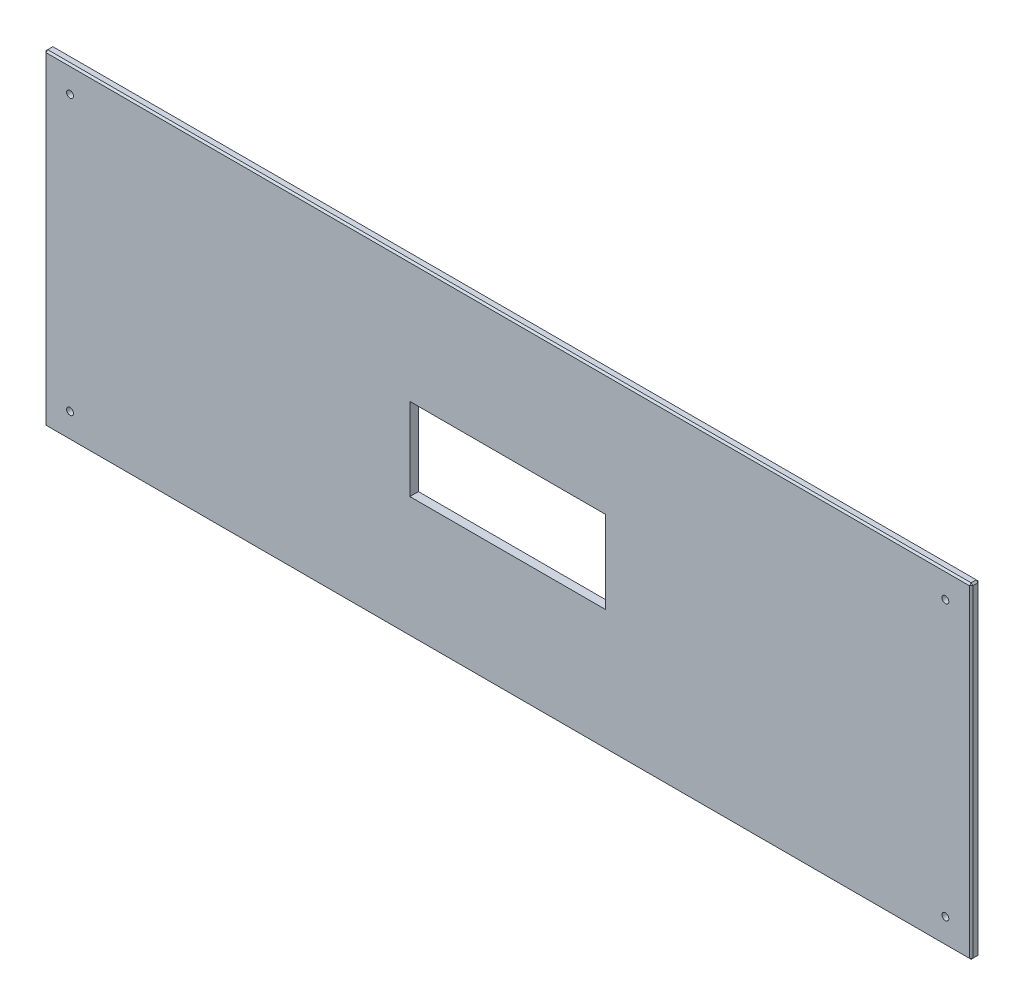
ISO-10303-21;
HEADER;
FILE_DESCRIPTION(('STEP AP214'),'2;1');
FILE_NAME('part.step','',(''),(''),'','','');
FILE_SCHEMA(('AUTOMOTIVE_DESIGN { 1 0 10303 214 1 1 1 1 }'));
ENDSEC;
DATA;
#1=APPLICATION_CONTEXT('core data for automotive mechanical design processes');
#2=APPLICATION_PROTOCOL_DEFINITION('international standard','automotive_design',2000,#1);
#3=PRODUCT_CONTEXT('',#1,'mechanical');
#4=PRODUCT('Part','Part','',(#3));
#5=PRODUCT_RELATED_PRODUCT_CATEGORY('part','',(#4));
#6=PRODUCT_DEFINITION_FORMATION('','',#4);
#7=PRODUCT_DEFINITION_CONTEXT('part definition',#1,'design');
#8=PRODUCT_DEFINITION('design','',#6,#7);
#9=PRODUCT_DEFINITION_SHAPE('','',#8);
#10=(LENGTH_UNIT() NAMED_UNIT(*) SI_UNIT(.MILLI.,.METRE.));
#11=(NAMED_UNIT(*) PLANE_ANGLE_UNIT() SI_UNIT($,.RADIAN.));
#12=(NAMED_UNIT(*) SI_UNIT($,.STERADIAN.) SOLID_ANGLE_UNIT());
#13=UNCERTAINTY_MEASURE_WITH_UNIT(LENGTH_MEASURE(1.E-05),#10,'distance_accuracy_value','');
#14=(GEOMETRIC_REPRESENTATION_CONTEXT(3) GLOBAL_UNCERTAINTY_ASSIGNED_CONTEXT((#13)) GLOBAL_UNIT_ASSIGNED_CONTEXT((#10,
#11,#12)) REPRESENTATION_CONTEXT('',''));
#15=CARTESIAN_POINT('',(0.,0.,0.));
#16=DIRECTION('',(0.,0.,1.));
#17=DIRECTION('',(1.,0.,0.));
#18=AXIS2_PLACEMENT_3D('',#15,#16,#17);
#19=CARTESIAN_POINT('',(0.,0.,5.));
#20=DIRECTION('',(1.,0.,0.));
#21=DIRECTION('',(0.,0.,-1.));
#22=AXIS2_PLACEMENT_3D('',#19,#20,#21);
#23=PLANE('',#22);
#24=DIRECTION('',(0.,0.,-1.));
#25=VECTOR('',#24,1.);
#26=CARTESIAN_POINT('',(0.,189.,5.));
#27=LINE('',#26,#25);
#28=CARTESIAN_POINT('',(0.,189.,4.00000000000011));
#29=VERTEX_POINT('',#28);
#30=CARTESIAN_POINT('',(0.,189.,0.99999999999989));
#31=VERTEX_POINT('',#30);
#32=EDGE_CURVE('E247',#29,#31,#27,.T.);
#33=ORIENTED_EDGE('',*,*,#32,.T.);
#34=DIRECTION('',(0.,-1.,0.));
#35=VECTOR('',#34,1.);
#36=CARTESIAN_POINT('',(0.,0.,0.99999999999989));
#37=LINE('',#36,#35);
#38=CARTESIAN_POINT('',(0.,0.99999999999989,0.99999999999989));
#39=VERTEX_POINT('',#38);
#40=EDGE_CURVE('E249',#31,#39,#37,.T.);
#41=ORIENTED_EDGE('',*,*,#40,.T.);
#42=DIRECTION('',(0.,0.,1.));
#43=VECTOR('',#42,1.);
#44=CARTESIAN_POINT('',(0.,0.99999999999989,5.));
#45=LINE('',#44,#43);
#46=CARTESIAN_POINT('',(0.,0.99999999999989,4.00000000000011));
#47=VERTEX_POINT('',#46);
#48=EDGE_CURVE('E243',#39,#47,#45,.T.);
#49=ORIENTED_EDGE('',*,*,#48,.T.);
#50=DIRECTION('',(0.,1.,0.));
#51=VECTOR('',#50,1.);
#52=CARTESIAN_POINT('',(0.,0.,4.00000000000011));
#53=LINE('',#52,#51);
#54=EDGE_CURVE('E245',#47,#29,#53,.T.);
#55=ORIENTED_EDGE('',*,*,#54,.T.);
#56=EDGE_LOOP('',(#33,#41,#49,#55));
#57=FACE_BOUND('',#56,.T.);
#58=ADVANCED_FACE('F40',(#57),#23,.F.);
#59=CARTESIAN_POINT('',(0.,0.,5.));
#60=DIRECTION('',(0.,1.,0.));
#61=DIRECTION('',(0.,0.,1.));
#62=AXIS2_PLACEMENT_3D('',#59,#60,#61);
#63=PLANE('',#62);
#64=DIRECTION('',(0.,0.,-1.));
#65=VECTOR('',#64,1.);
#66=CARTESIAN_POINT('',(0.99999999999989,0.,5.));
#67=LINE('',#66,#65);
#68=CARTESIAN_POINT('',(0.99999999999989,0.,4.00000000000011));
#69=VERTEX_POINT('',#68);
#70=CARTESIAN_POINT('',(0.99999999999989,0.,0.99999999999989));
#71=VERTEX_POINT('',#70);
#72=EDGE_CURVE('E211',#69,#71,#67,.T.);
#73=ORIENTED_EDGE('',*,*,#72,.T.);
#74=DIRECTION('',(1.,0.,0.));
#75=VECTOR('',#74,1.);
#76=CARTESIAN_POINT('',(540.,0.,0.99999999999989));
#77=LINE('',#76,#75);
#78=CARTESIAN_POINT('',(539.,0.,0.99999999999989));
#79=VERTEX_POINT('',#78);
#80=EDGE_CURVE('E213',#71,#79,#77,.T.);
#81=ORIENTED_EDGE('',*,*,#80,.T.);
#82=DIRECTION('',(0.,0.,1.));
#83=VECTOR('',#82,1.);
#84=CARTESIAN_POINT('',(539.,0.,5.));
#85=LINE('',#84,#83);
#86=CARTESIAN_POINT('',(539.,0.,4.00000000000011));
#87=VERTEX_POINT('',#86);
#88=EDGE_CURVE('E206',#79,#87,#85,.T.);
#89=ORIENTED_EDGE('',*,*,#88,.T.);
#90=DIRECTION('',(-1.,0.,0.));
#91=VECTOR('',#90,1.);
#92=CARTESIAN_POINT('',(0.,0.,4.00000000000011));
#93=LINE('',#92,#91);
#94=EDGE_CURVE('E208',#87,#69,#93,.T.);
#95=ORIENTED_EDGE('',*,*,#94,.T.);
#96=EDGE_LOOP('',(#73,#81,#89,#95));
#97=FACE_BOUND('',#96,.T.);
#98=ADVANCED_FACE('F351',(#97),#63,.F.);
#99=CARTESIAN_POINT('',(540.,0.,5.));
#100=DIRECTION('',(-1.,0.,0.));
#101=DIRECTION('',(0.,0.,1.));
#102=AXIS2_PLACEMENT_3D('',#99,#100,#101);
#103=PLANE('',#102);
#104=DIRECTION('',(0.,0.,-1.));
#105=VECTOR('',#104,1.);
#106=CARTESIAN_POINT('',(540.,0.99999999999989,5.));
#107=LINE('',#106,#105);
#108=CARTESIAN_POINT('',(540.,0.99999999999989,4.00000000000011));
#109=VERTEX_POINT('',#108);
#110=CARTESIAN_POINT('',(540.,0.99999999999989,0.99999999999989));
#111=VERTEX_POINT('',#110);
#112=EDGE_CURVE('E229',#109,#111,#107,.T.);
#113=ORIENTED_EDGE('',*,*,#112,.T.);
#114=DIRECTION('',(0.,1.,0.));
#115=VECTOR('',#114,1.);
#116=CARTESIAN_POINT('',(540.,190.,0.99999999999989));
#117=LINE('',#116,#115);
#118=CARTESIAN_POINT('',(540.,189.,0.99999999999989));
#119=VERTEX_POINT('',#118);
#120=EDGE_CURVE('E231',#111,#119,#117,.T.);
#121=ORIENTED_EDGE('',*,*,#120,.T.);
#122=DIRECTION('',(0.,0.,1.));
#123=VECTOR('',#122,1.);
#124=CARTESIAN_POINT('',(540.,189.,5.));
#125=LINE('',#124,#123);
#126=CARTESIAN_POINT('',(540.,189.,4.00000000000011));
#127=VERTEX_POINT('',#126);
#128=EDGE_CURVE('E225',#119,#127,#125,.T.);
#129=ORIENTED_EDGE('',*,*,#128,.T.);
#130=DIRECTION('',(0.,-1.,0.));
#131=VECTOR('',#130,1.);
#132=CARTESIAN_POINT('',(540.,0.,4.00000000000011));
#133=LINE('',#132,#131);
#134=EDGE_CURVE('E227',#127,#109,#133,.T.);
#135=ORIENTED_EDGE('',*,*,#134,.T.);
#136=EDGE_LOOP('',(#113,#121,#129,#135));
#137=FACE_BOUND('',#136,.T.);
#138=ADVANCED_FACE('F357',(#137),#103,.F.);
#139=CARTESIAN_POINT('',(0.,190.,5.));
#140=DIRECTION('',(0.,-1.,0.));
#141=DIRECTION('',(0.,0.,-1.));
#142=AXIS2_PLACEMENT_3D('',#139,#140,#141);
#143=PLANE('',#142);
#144=DIRECTION('',(-1.,0.,0.));
#145=VECTOR('',#144,1.);
#146=CARTESIAN_POINT('',(0.,190.,0.99999999999989));
#147=LINE('',#146,#145);
#148=CARTESIAN_POINT('',(539.,190.,0.99999999999989));
#149=VERTEX_POINT('',#148);
#150=CARTESIAN_POINT('',(0.99999999999989,190.,0.99999999999989));
#151=VERTEX_POINT('',#150);
#152=EDGE_CURVE('E238',#149,#151,#147,.T.);
#153=ORIENTED_EDGE('',*,*,#152,.T.);
#154=DIRECTION('',(0.,0.,1.));
#155=VECTOR('',#154,1.);
#156=CARTESIAN_POINT('',(0.99999999999989,190.,5.));
#157=LINE('',#156,#155);
#158=CARTESIAN_POINT('',(0.99999999999989,190.,4.00000000000011));
#159=VERTEX_POINT('',#158);
#160=EDGE_CURVE('E241',#151,#159,#157,.T.);
#161=ORIENTED_EDGE('',*,*,#160,.T.);
#162=DIRECTION('',(1.,0.,0.));
#163=VECTOR('',#162,1.);
#164=CARTESIAN_POINT('',(0.,190.,4.00000000000011));
#165=LINE('',#164,#163);
#166=CARTESIAN_POINT('',(539.,190.,4.00000000000011));
#167=VERTEX_POINT('',#166);
#168=EDGE_CURVE('E236',#159,#167,#165,.T.);
#169=ORIENTED_EDGE('',*,*,#168,.T.);
#170=DIRECTION('',(0.,0.,-1.));
#171=VECTOR('',#170,1.);
#172=CARTESIAN_POINT('',(539.,190.,5.));
#173=LINE('',#172,#171);
#174=EDGE_CURVE('E234',#167,#149,#173,.T.);
#175=ORIENTED_EDGE('',*,*,#174,.T.);
#176=EDGE_LOOP('',(#153,#161,#169,#175));
#177=FACE_BOUND('',#176,.T.);
#178=ADVANCED_FACE('F533',(#177),#143,.F.);
#179=CARTESIAN_POINT('',(0.,0.,5.));
#180=DIRECTION('',(0.,0.,-1.));
#181=DIRECTION('',(-1.,0.,0.));
#182=AXIS2_PLACEMENT_3D('',#179,#180,#181);
#183=PLANE('',#182);
#184=DIRECTION('',(1.,0.,0.));
#185=VECTOR('',#184,1.);
#186=CARTESIAN_POINT('',(213.,71.,5.));
#187=LINE('',#186,#185);
#188=CARTESIAN_POINT('',(213.,71.,5.));
#189=VERTEX_POINT('',#188);
#190=CARTESIAN_POINT('',(327.,71.,5.));
#191=VERTEX_POINT('',#190);
#192=EDGE_CURVE('E165',#189,#191,#187,.T.);
#193=ORIENTED_EDGE('',*,*,#192,.F.);
#194=DIRECTION('',(0.,-1.,0.));
#195=VECTOR('',#194,1.);
#196=CARTESIAN_POINT('',(213.,119.,5.));
#197=LINE('',#196,#195);
#198=CARTESIAN_POINT('',(213.,119.,5.));
#199=VERTEX_POINT('',#198);
#200=EDGE_CURVE('E56',#199,#189,#197,.T.);
#201=ORIENTED_EDGE('',*,*,#200,.F.);
#202=DIRECTION('',(-1.,0.,0.));
#203=VECTOR('',#202,1.);
#204=CARTESIAN_POINT('',(213.,119.,5.));
#205=LINE('',#204,#203);
#206=CARTESIAN_POINT('',(327.,119.,5.));
#207=VERTEX_POINT('',#206);
#208=EDGE_CURVE('E172',#207,#199,#205,.T.);
#209=ORIENTED_EDGE('',*,*,#208,.F.);
#210=DIRECTION('',(0.,1.,0.));
#211=VECTOR('',#210,1.);
#212=CARTESIAN_POINT('',(327.,119.,5.));
#213=LINE('',#212,#211);
#214=EDGE_CURVE('E156',#191,#207,#213,.T.);
#215=ORIENTED_EDGE('',*,*,#214,.F.);
#216=EDGE_LOOP('',(#193,#201,#209,#215));
#217=FACE_BOUND('',#216,.T.);
#218=CARTESIAN_POINT('',(525.,15.,5.));
#219=DIRECTION('',(0.,0.,1.));
#220=DIRECTION('',(1.,0.,0.));
#221=AXIS2_PLACEMENT_3D('',#218,#219,#220);
#222=CIRCLE('',#221,2.);
#223=CARTESIAN_POINT('',(527.,15.,5.));
#224=VERTEX_POINT('',#223);
#225=EDGE_CURVE('E192',#224,#224,#222,.T.);
#226=ORIENTED_EDGE('',*,*,#225,.F.);
#227=EDGE_LOOP('',(#226));
#228=FACE_BOUND('',#227,.T.);
#229=CARTESIAN_POINT('',(15.,175.,5.));
#230=DIRECTION('',(0.,0.,1.));
#231=DIRECTION('',(1.,0.,0.));
#232=AXIS2_PLACEMENT_3D('',#229,#230,#231);
#233=CIRCLE('',#232,2.);
#234=CARTESIAN_POINT('',(17.,175.,5.));
#235=VERTEX_POINT('',#234);
#236=EDGE_CURVE('E185',#235,#235,#233,.T.);
#237=ORIENTED_EDGE('',*,*,#236,.F.);
#238=EDGE_LOOP('',(#237));
#239=FACE_BOUND('',#238,.T.);
#240=CARTESIAN_POINT('',(15.,15.,5.));
#241=DIRECTION('',(0.,0.,1.));
#242=DIRECTION('',(1.,0.,0.));
#243=AXIS2_PLACEMENT_3D('',#240,#241,#242);
#244=CIRCLE('',#243,2.00000000000001);
#245=CARTESIAN_POINT('',(17.,15.,5.));
#246=VERTEX_POINT('',#245);
#247=EDGE_CURVE('E179',#246,#246,#244,.T.);
#248=ORIENTED_EDGE('',*,*,#247,.F.);
#249=EDGE_LOOP('',(#248));
#250=FACE_BOUND('',#249,.T.);
#251=CARTESIAN_POINT('',(525.,175.,5.));
#252=DIRECTION('',(0.,0.,1.));
#253=DIRECTION('',(1.,0.,0.));
#254=AXIS2_PLACEMENT_3D('',#251,#252,#253);
#255=CIRCLE('',#254,2.);
#256=CARTESIAN_POINT('',(527.,175.,5.));
#257=VERTEX_POINT('',#256);
#258=EDGE_CURVE('E191',#257,#257,#255,.T.);
#259=ORIENTED_EDGE('',*,*,#258,.F.);
#260=EDGE_LOOP('',(#259));
#261=FACE_BOUND('',#260,.T.);
#262=DIRECTION('',(0.,1.,0.));
#263=VECTOR('',#262,1.);
#264=CARTESIAN_POINT('',(539.,0.,5.));
#265=LINE('',#264,#263);
#266=CARTESIAN_POINT('',(539.,0.99999999999989,5.));
#267=VERTEX_POINT('',#266);
#268=CARTESIAN_POINT('',(539.,189.,5.));
#269=VERTEX_POINT('',#268);
#270=EDGE_CURVE('E252',#267,#269,#265,.T.);
#271=ORIENTED_EDGE('',*,*,#270,.T.);
#272=DIRECTION('',(-1.,0.,0.));
#273=VECTOR('',#272,1.);
#274=CARTESIAN_POINT('',(0.,189.,5.));
#275=LINE('',#274,#273);
#276=CARTESIAN_POINT('',(0.99999999999989,189.,5.));
#277=VERTEX_POINT('',#276);
#278=EDGE_CURVE('E258',#269,#277,#275,.T.);
#279=ORIENTED_EDGE('',*,*,#278,.T.);
#280=DIRECTION('',(0.,-1.,0.));
#281=VECTOR('',#280,1.);
#282=CARTESIAN_POINT('',(0.99999999999989,0.,5.));
#283=LINE('',#282,#281);
#284=CARTESIAN_POINT('',(0.99999999999989,0.99999999999989,5.));
#285=VERTEX_POINT('',#284);
#286=EDGE_CURVE('E256',#277,#285,#283,.T.);
#287=ORIENTED_EDGE('',*,*,#286,.T.);
#288=DIRECTION('',(1.,0.,0.));
#289=VECTOR('',#288,1.);
#290=CARTESIAN_POINT('',(0.,0.99999999999989,5.));
#291=LINE('',#290,#289);
#292=EDGE_CURVE('E254',#285,#267,#291,.T.);
#293=ORIENTED_EDGE('',*,*,#292,.T.);
#294=EDGE_LOOP('',(#271,#279,#287,#293));
#295=FACE_BOUND('',#294,.T.);
#296=ADVANCED_FACE('F169',(#217,#228,#239,#250,#261,#295),#183,.F.);
#297=CARTESIAN_POINT('',(0.,0.,0.));
#298=DIRECTION('',(0.,0.,-1.));
#299=DIRECTION('',(-1.,0.,0.));
#300=AXIS2_PLACEMENT_3D('',#297,#298,#299);
#301=PLANE('',#300);
#302=DIRECTION('',(0.,1.,0.));
#303=VECTOR('',#302,1.);
#304=CARTESIAN_POINT('',(213.,0.,0.));
#305=LINE('',#304,#303);
#306=CARTESIAN_POINT('',(213.,71.,0.));
#307=VERTEX_POINT('',#306);
#308=CARTESIAN_POINT('',(213.,119.,0.));
#309=VERTEX_POINT('',#308);
#310=EDGE_CURVE('E11',#307,#309,#305,.T.);
#311=ORIENTED_EDGE('',*,*,#310,.F.);
#312=DIRECTION('',(-1.,0.,0.));
#313=VECTOR('',#312,1.);
#314=CARTESIAN_POINT('',(0.,71.,0.));
#315=LINE('',#314,#313);
#316=CARTESIAN_POINT('',(327.,71.,0.));
#317=VERTEX_POINT('',#316);
#318=EDGE_CURVE('E261',#317,#307,#315,.T.);
#319=ORIENTED_EDGE('',*,*,#318,.F.);
#320=DIRECTION('',(0.,-1.,0.));
#321=VECTOR('',#320,1.);
#322=CARTESIAN_POINT('',(327.,0.,0.));
#323=LINE('',#322,#321);
#324=CARTESIAN_POINT('',(327.,119.,0.));
#325=VERTEX_POINT('',#324);
#326=EDGE_CURVE('E159',#325,#317,#323,.T.);
#327=ORIENTED_EDGE('',*,*,#326,.F.);
#328=DIRECTION('',(1.,0.,0.));
#329=VECTOR('',#328,1.);
#330=CARTESIAN_POINT('',(0.,119.,0.));
#331=LINE('',#330,#329);
#332=EDGE_CURVE('E49',#309,#325,#331,.T.);
#333=ORIENTED_EDGE('',*,*,#332,.F.);
#334=EDGE_LOOP('',(#311,#319,#327,#333));
#335=FACE_BOUND('',#334,.T.);
#336=CARTESIAN_POINT('',(525.,15.,0.));
#337=DIRECTION('',(0.,0.,1.));
#338=DIRECTION('',(1.,0.,0.));
#339=AXIS2_PLACEMENT_3D('',#336,#337,#338);
#340=CIRCLE('',#339,2.);
#341=CARTESIAN_POINT('',(527.,15.,0.));
#342=VERTEX_POINT('',#341);
#343=EDGE_CURVE('E188',#342,#342,#340,.T.);
#344=ORIENTED_EDGE('',*,*,#343,.T.);
#345=EDGE_LOOP('',(#344));
#346=FACE_BOUND('',#345,.T.);
#347=CARTESIAN_POINT('',(15.,175.,0.));
#348=DIRECTION('',(0.,0.,1.));
#349=DIRECTION('',(1.,0.,0.));
#350=AXIS2_PLACEMENT_3D('',#347,#348,#349);
#351=CIRCLE('',#350,2.);
#352=CARTESIAN_POINT('',(17.,175.,0.));
#353=VERTEX_POINT('',#352);
#354=EDGE_CURVE('E195',#353,#353,#351,.T.);
#355=ORIENTED_EDGE('',*,*,#354,.T.);
#356=EDGE_LOOP('',(#355));
#357=FACE_BOUND('',#356,.T.);
#358=CARTESIAN_POINT('',(15.,15.,0.));
#359=DIRECTION('',(0.,0.,1.));
#360=DIRECTION('',(1.,0.,0.));
#361=AXIS2_PLACEMENT_3D('',#358,#359,#360);
#362=CIRCLE('',#361,2.00000000000001);
#363=CARTESIAN_POINT('',(17.,15.,0.));
#364=VERTEX_POINT('',#363);
#365=EDGE_CURVE('E182',#364,#364,#362,.T.);
#366=ORIENTED_EDGE('',*,*,#365,.T.);
#367=EDGE_LOOP('',(#366));
#368=FACE_BOUND('',#367,.T.);
#369=CARTESIAN_POINT('',(525.,175.,0.));
#370=DIRECTION('',(0.,0.,1.));
#371=DIRECTION('',(1.,0.,0.));
#372=AXIS2_PLACEMENT_3D('',#369,#370,#371);
#373=CIRCLE('',#372,2.);
#374=CARTESIAN_POINT('',(527.,175.,0.));
#375=VERTEX_POINT('',#374);
#376=EDGE_CURVE('E200',#375,#375,#373,.T.);
#377=ORIENTED_EDGE('',*,*,#376,.T.);
#378=EDGE_LOOP('',(#377));
#379=FACE_BOUND('',#378,.T.);
#380=DIRECTION('',(0.,-1.,0.));
#381=VECTOR('',#380,1.);
#382=CARTESIAN_POINT('',(539.,0.,0.));
#383=LINE('',#382,#381);
#384=CARTESIAN_POINT('',(539.,189.,0.));
#385=VERTEX_POINT('',#384);
#386=CARTESIAN_POINT('',(539.,0.99999999999989,0.));
#387=VERTEX_POINT('',#386);
#388=EDGE_CURVE('E220',#385,#387,#383,.T.);
#389=ORIENTED_EDGE('',*,*,#388,.T.);
#390=DIRECTION('',(-1.,0.,0.));
#391=VECTOR('',#390,1.);
#392=CARTESIAN_POINT('',(0.,0.99999999999989,0.));
#393=LINE('',#392,#391);
#394=CARTESIAN_POINT('',(0.99999999999989,0.99999999999989,0.));
#395=VERTEX_POINT('',#394);
#396=EDGE_CURVE('E222',#387,#395,#393,.T.);
#397=ORIENTED_EDGE('',*,*,#396,.T.);
#398=DIRECTION('',(0.,1.,0.));
#399=VECTOR('',#398,1.);
#400=CARTESIAN_POINT('',(0.99999999999989,190.,0.));
#401=LINE('',#400,#399);
#402=CARTESIAN_POINT('',(0.99999999999989,189.,0.));
#403=VERTEX_POINT('',#402);
#404=EDGE_CURVE('E216',#395,#403,#401,.T.);
#405=ORIENTED_EDGE('',*,*,#404,.T.);
#406=DIRECTION('',(1.,0.,0.));
#407=VECTOR('',#406,1.);
#408=CARTESIAN_POINT('',(540.,189.,0.));
#409=LINE('',#408,#407);
#410=EDGE_CURVE('E218',#403,#385,#409,.T.);
#411=ORIENTED_EDGE('',*,*,#410,.T.);
#412=EDGE_LOOP('',(#389,#397,#405,#411));
#413=FACE_BOUND('',#412,.T.);
#414=ADVANCED_FACE('F334',(#335,#346,#357,#368,#379,#413),#301,.T.);
#415=CARTESIAN_POINT('',(0.,189.,5.));
#416=DIRECTION('',(0.,-0.707106781186548,-0.707106781186548));
#417=DIRECTION('',(-1.,0.,0.));
#418=AXIS2_PLACEMENT_3D('',#415,#416,#417);
#419=PLANE('',#418);
#420=DIRECTION('',(0.,-0.707106781186548,0.707106781186548));
#421=VECTOR('',#420,1.);
#422=CARTESIAN_POINT('',(0.99999999999989,189.,5.));
#423=LINE('',#422,#421);
#424=EDGE_CURVE('E209',#277,#159,#423,.F.);
#425=ORIENTED_EDGE('',*,*,#424,.F.);
#426=ORIENTED_EDGE('',*,*,#278,.F.);
#427=DIRECTION('',(0.,0.707106781186548,-0.707106781186548));
#428=VECTOR('',#427,1.);
#429=CARTESIAN_POINT('',(539.,190.,4.00000000000011));
#430=LINE('',#429,#428);
#431=EDGE_CURVE('E322',#167,#269,#430,.F.);
#432=ORIENTED_EDGE('',*,*,#431,.F.);
#433=ORIENTED_EDGE('',*,*,#168,.F.);
#434=EDGE_LOOP('',(#425,#426,#432,#433));
#435=FACE_BOUND('',#434,.T.);
#436=ADVANCED_FACE('F43',(#435),#419,.F.);
#437=CARTESIAN_POINT('',(0.99999999999989,189.,5.));
#438=DIRECTION('',(-0.577350269189626,0.577350269189626,0.577350269189626));
#439=DIRECTION('',(0.707106781186547,0.,0.707106781186547));
#440=AXIS2_PLACEMENT_3D('',#437,#438,#439);
#441=PLANE('',#440);
#442=DIRECTION('',(-0.707106781186548,0.,-0.707106781186548));
#443=VECTOR('',#442,1.);
#444=CARTESIAN_POINT('',(0.99999999999989,189.,5.));
#445=LINE('',#444,#443);
#446=EDGE_CURVE('E316',#277,#29,#445,.T.);
#447=ORIENTED_EDGE('',*,*,#446,.F.);
#448=ORIENTED_EDGE('',*,*,#424,.T.);
#449=DIRECTION('',(0.707106781186548,0.707106781186548,0.));
#450=VECTOR('',#449,1.);
#451=CARTESIAN_POINT('',(0.499999999999945,189.5,4.00000000000011));
#452=LINE('',#451,#450);
#453=EDGE_CURVE('E319',#29,#159,#452,.T.);
#454=ORIENTED_EDGE('',*,*,#453,.F.);
#455=EDGE_LOOP('',(#447,#448,#454));
#456=FACE_BOUND('',#455,.T.);
#457=ADVANCED_FACE('F488',(#456),#441,.T.);
#458=CARTESIAN_POINT('',(539.,190.,4.00000000000011));
#459=DIRECTION('',(0.577350269189626,0.577350269189626,0.577350269189626));
#460=DIRECTION('',(0.707106781186547,0.,-0.707106781186547));
#461=AXIS2_PLACEMENT_3D('',#458,#459,#460);
#462=PLANE('',#461);
#463=DIRECTION('',(0.707106781186548,-0.707106781186548,0.));
#464=VECTOR('',#463,1.);
#465=CARTESIAN_POINT('',(539.,190.,4.00000000000011));
#466=LINE('',#465,#464);
#467=EDGE_CURVE('E310',#167,#127,#466,.T.);
#468=ORIENTED_EDGE('',*,*,#467,.F.);
#469=ORIENTED_EDGE('',*,*,#431,.T.);
#470=DIRECTION('',(-0.707106781186548,0.,0.707106781186548));
#471=VECTOR('',#470,1.);
#472=CARTESIAN_POINT('',(539.5,189.,4.50000000000006));
#473=LINE('',#472,#471);
#474=EDGE_CURVE('E313',#127,#269,#473,.T.);
#475=ORIENTED_EDGE('',*,*,#474,.F.);
#476=EDGE_LOOP('',(#468,#469,#475));
#477=FACE_BOUND('',#476,.T.);
#478=ADVANCED_FACE('F482',(#477),#462,.T.);
#479=CARTESIAN_POINT('',(0.,189.,5.));
#480=DIRECTION('',(0.707106781186548,-0.707106781186548,0.));
#481=DIRECTION('',(0.,0.,-1.));
#482=AXIS2_PLACEMENT_3D('',#479,#480,#481);
#483=PLANE('',#482);
#484=ORIENTED_EDGE('',*,*,#453,.T.);
#485=ORIENTED_EDGE('',*,*,#160,.F.);
#486=DIRECTION('',(-0.707106781186548,-0.707106781186548,0.));
#487=VECTOR('',#486,1.);
#488=CARTESIAN_POINT('',(0.99999999999989,190.,0.99999999999989));
#489=LINE('',#488,#487);
#490=EDGE_CURVE('E305',#31,#151,#489,.F.);
#491=ORIENTED_EDGE('',*,*,#490,.F.);
#492=ORIENTED_EDGE('',*,*,#32,.F.);
#493=EDGE_LOOP('',(#484,#485,#491,#492));
#494=FACE_BOUND('',#493,.T.);
#495=ADVANCED_FACE('F475',(#494),#483,.F.);
#496=CARTESIAN_POINT('',(0.99999999999989,0.,5.));
#497=DIRECTION('',(0.707106781186548,0.,-0.707106781186548));
#498=DIRECTION('',(0.,-1.,0.));
#499=AXIS2_PLACEMENT_3D('',#496,#497,#498);
#500=PLANE('',#499);
#501=ORIENTED_EDGE('',*,*,#446,.T.);
#502=ORIENTED_EDGE('',*,*,#54,.F.);
#503=DIRECTION('',(0.707106781186548,0.,0.707106781186548));
#504=VECTOR('',#503,1.);
#505=CARTESIAN_POINT('',(0.99999999999989,0.99999999999989,5.));
#506=LINE('',#505,#504);
#507=EDGE_CURVE('E302',#285,#47,#506,.F.);
#508=ORIENTED_EDGE('',*,*,#507,.F.);
#509=ORIENTED_EDGE('',*,*,#286,.F.);
#510=EDGE_LOOP('',(#501,#502,#508,#509));
#511=FACE_BOUND('',#510,.T.);
#512=ADVANCED_FACE('F468',(#511),#500,.F.);
#513=CARTESIAN_POINT('',(0.,0.99999999999989,5.));
#514=DIRECTION('',(0.,0.707106781186548,-0.707106781186548));
#515=DIRECTION('',(1.,0.,0.));
#516=AXIS2_PLACEMENT_3D('',#513,#514,#515);
#517=PLANE('',#516);
#518=DIRECTION('',(0.,0.707106781186548,0.707106781186548));
#519=VECTOR('',#518,1.);
#520=CARTESIAN_POINT('',(539.,0.99999999999989,5.));
#521=LINE('',#520,#519);
#522=EDGE_CURVE('E296',#267,#87,#521,.F.);
#523=ORIENTED_EDGE('',*,*,#522,.F.);
#524=ORIENTED_EDGE('',*,*,#292,.F.);
#525=DIRECTION('',(0.,-0.707106781186548,-0.707106781186548));
#526=VECTOR('',#525,1.);
#527=CARTESIAN_POINT('',(0.99999999999989,0.99999999999989,5.));
#528=LINE('',#527,#526);
#529=EDGE_CURVE('E299',#69,#285,#528,.F.);
#530=ORIENTED_EDGE('',*,*,#529,.F.);
#531=ORIENTED_EDGE('',*,*,#94,.F.);
#532=EDGE_LOOP('',(#523,#524,#530,#531));
#533=FACE_BOUND('',#532,.T.);
#534=ADVANCED_FACE('F461',(#533),#517,.F.);
#535=CARTESIAN_POINT('',(539.,0.,5.));
#536=DIRECTION('',(-0.707106781186548,0.,-0.707106781186548));
#537=DIRECTION('',(0.,1.,0.));
#538=AXIS2_PLACEMENT_3D('',#535,#536,#537);
#539=PLANE('',#538);
#540=ORIENTED_EDGE('',*,*,#474,.T.);
#541=ORIENTED_EDGE('',*,*,#270,.F.);
#542=DIRECTION('',(0.707106781186548,0.,-0.707106781186548));
#543=VECTOR('',#542,1.);
#544=CARTESIAN_POINT('',(539.,0.99999999999989,5.));
#545=LINE('',#544,#543);
#546=EDGE_CURVE('E293',#109,#267,#545,.F.);
#547=ORIENTED_EDGE('',*,*,#546,.F.);
#548=ORIENTED_EDGE('',*,*,#134,.F.);
#549=EDGE_LOOP('',(#540,#541,#547,#548));
#550=FACE_BOUND('',#549,.T.);
#551=ADVANCED_FACE('F454',(#550),#539,.F.);
#552=CARTESIAN_POINT('',(539.,190.,5.));
#553=DIRECTION('',(-0.707106781186548,-0.707106781186548,0.));
#554=DIRECTION('',(0.,0.,-1.));
#555=AXIS2_PLACEMENT_3D('',#552,#553,#554);
#556=PLANE('',#555);
#557=ORIENTED_EDGE('',*,*,#467,.T.);
#558=ORIENTED_EDGE('',*,*,#128,.F.);
#559=DIRECTION('',(-0.707106781186548,0.707106781186548,0.));
#560=VECTOR('',#559,1.);
#561=CARTESIAN_POINT('',(540.,189.,0.99999999999989));
#562=LINE('',#561,#560);
#563=EDGE_CURVE('E290',#149,#119,#562,.F.);
#564=ORIENTED_EDGE('',*,*,#563,.F.);
#565=ORIENTED_EDGE('',*,*,#174,.F.);
#566=EDGE_LOOP('',(#557,#558,#564,#565));
#567=FACE_BOUND('',#566,.T.);
#568=ADVANCED_FACE('F447',(#567),#556,.F.);
#569=CARTESIAN_POINT('',(0.,190.,0.99999999999989));
#570=DIRECTION('',(0.,0.707106781186548,-0.707106781186548));
#571=DIRECTION('',(1.,0.,0.));
#572=AXIS2_PLACEMENT_3D('',#569,#570,#571);
#573=PLANE('',#572);
#574=DIRECTION('',(0.,-0.707106781186548,-0.707106781186548));
#575=VECTOR('',#574,1.);
#576=CARTESIAN_POINT('',(0.99999999999989,190.,0.99999999999989));
#577=LINE('',#576,#575);
#578=EDGE_CURVE('E307',#151,#403,#577,.T.);
#579=ORIENTED_EDGE('',*,*,#578,.F.);
#580=ORIENTED_EDGE('',*,*,#152,.F.);
#581=DIRECTION('',(0.,0.707106781186548,0.707106781186548));
#582=VECTOR('',#581,1.);
#583=CARTESIAN_POINT('',(539.,189.5,0.499999999999945));
#584=LINE('',#583,#582);
#585=EDGE_CURVE('E287',#385,#149,#584,.T.);
#586=ORIENTED_EDGE('',*,*,#585,.F.);
#587=ORIENTED_EDGE('',*,*,#410,.F.);
#588=EDGE_LOOP('',(#579,#580,#586,#587));
#589=FACE_BOUND('',#588,.T.);
#590=ADVANCED_FACE('F440',(#589),#573,.T.);
#591=CARTESIAN_POINT('',(0.99999999999989,190.,0.99999999999989));
#592=DIRECTION('',(-0.577350269189626,0.577350269189626,-0.577350269189626));
#593=DIRECTION('',(-0.707106781186547,0.,0.707106781186547));
#594=AXIS2_PLACEMENT_3D('',#591,#592,#593);
#595=PLANE('',#594);
#596=ORIENTED_EDGE('',*,*,#490,.T.);
#597=ORIENTED_EDGE('',*,*,#578,.T.);
#598=DIRECTION('',(-0.707106781186548,0.,0.707106781186548));
#599=VECTOR('',#598,1.);
#600=CARTESIAN_POINT('',(0.499999999999945,189.,0.499999999999945));
#601=LINE('',#600,#599);
#602=EDGE_CURVE('E284',#31,#403,#601,.F.);
#603=ORIENTED_EDGE('',*,*,#602,.F.);
#604=EDGE_LOOP('',(#596,#597,#603));
#605=FACE_BOUND('',#604,.T.);
#606=ADVANCED_FACE('F433',(#605),#595,.T.);
#607=CARTESIAN_POINT('',(0.99999999999989,0.99999999999989,5.));
#608=DIRECTION('',(-0.577350269189626,-0.577350269189626,0.577350269189626));
#609=DIRECTION('',(0.707106781186547,0.,0.707106781186547));
#610=AXIS2_PLACEMENT_3D('',#607,#608,#609);
#611=PLANE('',#610);
#612=ORIENTED_EDGE('',*,*,#529,.T.);
#613=ORIENTED_EDGE('',*,*,#507,.T.);
#614=DIRECTION('',(-0.707106781186548,0.707106781186548,0.));
#615=VECTOR('',#614,1.);
#616=CARTESIAN_POINT('',(0.499999999999945,0.499999999999945,4.00000000000011));
#617=LINE('',#616,#615);
#618=EDGE_CURVE('E281',#69,#47,#617,.T.);
#619=ORIENTED_EDGE('',*,*,#618,.F.);
#620=EDGE_LOOP('',(#612,#613,#619));
#621=FACE_BOUND('',#620,.T.);
#622=ADVANCED_FACE('F426',(#621),#611,.T.);
#623=CARTESIAN_POINT('',(539.,0.99999999999989,5.));
#624=DIRECTION('',(0.577350269189626,-0.577350269189626,0.577350269189626));
#625=DIRECTION('',(0.707106781186547,0.,-0.707106781186547));
#626=AXIS2_PLACEMENT_3D('',#623,#624,#625);
#627=PLANE('',#626);
#628=ORIENTED_EDGE('',*,*,#546,.T.);
#629=ORIENTED_EDGE('',*,*,#522,.T.);
#630=DIRECTION('',(-0.707106781186548,-0.707106781186548,0.));
#631=VECTOR('',#630,1.);
#632=CARTESIAN_POINT('',(539.5,0.499999999999945,4.00000000000011));
#633=LINE('',#632,#631);
#634=EDGE_CURVE('E278',#109,#87,#633,.T.);
#635=ORIENTED_EDGE('',*,*,#634,.F.);
#636=EDGE_LOOP('',(#628,#629,#635));
#637=FACE_BOUND('',#636,.T.);
#638=ADVANCED_FACE('F419',(#637),#627,.T.);
#639=CARTESIAN_POINT('',(540.,189.,0.99999999999989));
#640=DIRECTION('',(0.577350269189626,0.577350269189626,-0.577350269189626));
#641=DIRECTION('',(-0.707106781186547,0.,-0.707106781186547));
#642=AXIS2_PLACEMENT_3D('',#639,#640,#641);
#643=PLANE('',#642);
#644=ORIENTED_EDGE('',*,*,#585,.T.);
#645=ORIENTED_EDGE('',*,*,#563,.T.);
#646=DIRECTION('',(-0.707106781186548,0.,-0.707106781186548));
#647=VECTOR('',#646,1.);
#648=CARTESIAN_POINT('',(540.,189.,0.99999999999989));
#649=LINE('',#648,#647);
#650=EDGE_CURVE('E276',#385,#119,#649,.F.);
#651=ORIENTED_EDGE('',*,*,#650,.F.);
#652=EDGE_LOOP('',(#644,#645,#651));
#653=FACE_BOUND('',#652,.T.);
#654=ADVANCED_FACE('F412',(#653),#643,.T.);
#655=CARTESIAN_POINT('',(0.,0.,0.99999999999989));
#656=DIRECTION('',(-0.707106781186548,0.,-0.707106781186548));
#657=DIRECTION('',(0.,1.,0.));
#658=AXIS2_PLACEMENT_3D('',#655,#656,#657);
#659=PLANE('',#658);
#660=ORIENTED_EDGE('',*,*,#602,.T.);
#661=ORIENTED_EDGE('',*,*,#404,.F.);
#662=DIRECTION('',(0.707106781186548,0.,-0.707106781186548));
#663=VECTOR('',#662,1.);
#664=CARTESIAN_POINT('',(0.99999999999989,0.99999999999989,0.));
#665=LINE('',#664,#663);
#666=EDGE_CURVE('E273',#39,#395,#665,.T.);
#667=ORIENTED_EDGE('',*,*,#666,.F.);
#668=ORIENTED_EDGE('',*,*,#40,.F.);
#669=EDGE_LOOP('',(#660,#661,#667,#668));
#670=FACE_BOUND('',#669,.T.);
#671=ADVANCED_FACE('F405',(#670),#659,.T.);
#672=CARTESIAN_POINT('',(0.99999999999989,0.,5.));
#673=DIRECTION('',(0.707106781186548,0.707106781186548,0.));
#674=DIRECTION('',(0.,0.,-1.));
#675=AXIS2_PLACEMENT_3D('',#672,#673,#674);
#676=PLANE('',#675);
#677=ORIENTED_EDGE('',*,*,#618,.T.);
#678=ORIENTED_EDGE('',*,*,#48,.F.);
#679=DIRECTION('',(0.707106781186548,-0.707106781186548,0.));
#680=VECTOR('',#679,1.);
#681=CARTESIAN_POINT('',(0.499999999999945,0.499999999999945,0.99999999999989));
#682=LINE('',#681,#680);
#683=EDGE_CURVE('E271',#71,#39,#682,.F.);
#684=ORIENTED_EDGE('',*,*,#683,.F.);
#685=ORIENTED_EDGE('',*,*,#72,.F.);
#686=EDGE_LOOP('',(#677,#678,#684,#685));
#687=FACE_BOUND('',#686,.T.);
#688=ADVANCED_FACE('F398',(#687),#676,.F.);
#689=CARTESIAN_POINT('',(540.,0.99999999999989,5.));
#690=DIRECTION('',(-0.707106781186548,0.707106781186548,0.));
#691=DIRECTION('',(0.,0.,-1.));
#692=AXIS2_PLACEMENT_3D('',#689,#690,#691);
#693=PLANE('',#692);
#694=ORIENTED_EDGE('',*,*,#634,.T.);
#695=ORIENTED_EDGE('',*,*,#88,.F.);
#696=DIRECTION('',(0.707106781186548,0.707106781186548,0.));
#697=VECTOR('',#696,1.);
#698=CARTESIAN_POINT('',(539.,0.,0.99999999999989));
#699=LINE('',#698,#697);
#700=EDGE_CURVE('E268',#111,#79,#699,.F.);
#701=ORIENTED_EDGE('',*,*,#700,.F.);
#702=ORIENTED_EDGE('',*,*,#112,.F.);
#703=EDGE_LOOP('',(#694,#695,#701,#702));
#704=FACE_BOUND('',#703,.T.);
#705=ADVANCED_FACE('F391',(#704),#693,.F.);
#706=CARTESIAN_POINT('',(540.,0.,0.99999999999989));
#707=DIRECTION('',(0.707106781186548,0.,-0.707106781186548));
#708=DIRECTION('',(0.,-1.,0.));
#709=AXIS2_PLACEMENT_3D('',#706,#707,#708);
#710=PLANE('',#709);
#711=ORIENTED_EDGE('',*,*,#650,.T.);
#712=ORIENTED_EDGE('',*,*,#120,.F.);
#713=DIRECTION('',(0.707106781186548,0.,0.707106781186548));
#714=VECTOR('',#713,1.);
#715=CARTESIAN_POINT('',(539.5,0.99999999999989,0.499999999999945));
#716=LINE('',#715,#714);
#717=EDGE_CURVE('E265',#387,#111,#716,.T.);
#718=ORIENTED_EDGE('',*,*,#717,.F.);
#719=ORIENTED_EDGE('',*,*,#388,.F.);
#720=EDGE_LOOP('',(#711,#712,#718,#719));
#721=FACE_BOUND('',#720,.T.);
#722=ADVANCED_FACE('F384',(#721),#710,.T.);
#723=CARTESIAN_POINT('',(0.99999999999989,0.99999999999989,0.));
#724=DIRECTION('',(-0.577350269189626,-0.577350269189626,-0.577350269189626));
#725=DIRECTION('',(-0.707106781186547,0.,0.707106781186547));
#726=AXIS2_PLACEMENT_3D('',#723,#724,#725);
#727=PLANE('',#726);
#728=ORIENTED_EDGE('',*,*,#683,.T.);
#729=ORIENTED_EDGE('',*,*,#666,.T.);
#730=DIRECTION('',(0.,-0.707106781186548,0.707106781186548));
#731=VECTOR('',#730,1.);
#732=CARTESIAN_POINT('',(0.99999999999989,0.99999999999989,0.));
#733=LINE('',#732,#731);
#734=EDGE_CURVE('E263',#71,#395,#733,.F.);
#735=ORIENTED_EDGE('',*,*,#734,.F.);
#736=EDGE_LOOP('',(#728,#729,#735));
#737=FACE_BOUND('',#736,.T.);
#738=ADVANCED_FACE('F377',(#737),#727,.T.);
#739=CARTESIAN_POINT('',(539.,0.,0.99999999999989));
#740=DIRECTION('',(0.577350269189626,-0.577350269189626,-0.577350269189626));
#741=DIRECTION('',(-0.707106781186547,0.,-0.707106781186547));
#742=AXIS2_PLACEMENT_3D('',#739,#740,#741);
#743=PLANE('',#742);
#744=ORIENTED_EDGE('',*,*,#717,.T.);
#745=ORIENTED_EDGE('',*,*,#700,.T.);
#746=DIRECTION('',(0.,0.707106781186548,-0.707106781186548));
#747=VECTOR('',#746,1.);
#748=CARTESIAN_POINT('',(539.,0.,0.99999999999989));
#749=LINE('',#748,#747);
#750=EDGE_CURVE('E203',#387,#79,#749,.F.);
#751=ORIENTED_EDGE('',*,*,#750,.F.);
#752=EDGE_LOOP('',(#744,#745,#751));
#753=FACE_BOUND('',#752,.T.);
#754=ADVANCED_FACE('F370',(#753),#743,.T.);
#755=CARTESIAN_POINT('',(0.,0.,0.99999999999989));
#756=DIRECTION('',(0.,-0.707106781186548,-0.707106781186548));
#757=DIRECTION('',(-1.,0.,0.));
#758=AXIS2_PLACEMENT_3D('',#755,#756,#757);
#759=PLANE('',#758);
#760=ORIENTED_EDGE('',*,*,#734,.T.);
#761=ORIENTED_EDGE('',*,*,#396,.F.);
#762=ORIENTED_EDGE('',*,*,#750,.T.);
#763=ORIENTED_EDGE('',*,*,#80,.F.);
#764=EDGE_LOOP('',(#760,#761,#762,#763));
#765=FACE_BOUND('',#764,.T.);
#766=ADVANCED_FACE('F363',(#765),#759,.T.);
#767=CARTESIAN_POINT('',(525.,175.,0.));
#768=DIRECTION('',(0.,0.,1.));
#769=DIRECTION('',(1.,0.,0.));
#770=AXIS2_PLACEMENT_3D('',#767,#768,#769);
#771=CYLINDRICAL_SURFACE('',#770,2.);
#772=ORIENTED_EDGE('',*,*,#376,.F.);
#773=EDGE_LOOP('',(#772));
#774=FACE_BOUND('',#773,.T.);
#775=ORIENTED_EDGE('',*,*,#258,.T.);
#776=EDGE_LOOP('',(#775));
#777=FACE_BOUND('',#776,.T.);
#778=ADVANCED_FACE('F369',(#774,#777),#771,.F.);
#779=CARTESIAN_POINT('',(15.,15.,0.));
#780=DIRECTION('',(0.,0.,1.));
#781=DIRECTION('',(1.,0.,0.));
#782=AXIS2_PLACEMENT_3D('',#779,#780,#781);
#783=CYLINDRICAL_SURFACE('',#782,2.00000000000001);
#784=ORIENTED_EDGE('',*,*,#365,.F.);
#785=EDGE_LOOP('',(#784));
#786=FACE_BOUND('',#785,.T.);
#787=ORIENTED_EDGE('',*,*,#247,.T.);
#788=EDGE_LOOP('',(#787));
#789=FACE_BOUND('',#788,.T.);
#790=ADVANCED_FACE('F618',(#786,#789),#783,.F.);
#791=CARTESIAN_POINT('',(15.,175.,0.));
#792=DIRECTION('',(0.,0.,1.));
#793=DIRECTION('',(1.,0.,0.));
#794=AXIS2_PLACEMENT_3D('',#791,#792,#793);
#795=CYLINDRICAL_SURFACE('',#794,2.);
#796=ORIENTED_EDGE('',*,*,#354,.F.);
#797=EDGE_LOOP('',(#796));
#798=FACE_BOUND('',#797,.T.);
#799=ORIENTED_EDGE('',*,*,#236,.T.);
#800=EDGE_LOOP('',(#799));
#801=FACE_BOUND('',#800,.T.);
#802=ADVANCED_FACE('F345',(#798,#801),#795,.F.);
#803=CARTESIAN_POINT('',(525.,15.,0.));
#804=DIRECTION('',(0.,0.,1.));
#805=DIRECTION('',(1.,0.,0.));
#806=AXIS2_PLACEMENT_3D('',#803,#804,#805);
#807=CYLINDRICAL_SURFACE('',#806,2.);
#808=ORIENTED_EDGE('',*,*,#343,.F.);
#809=EDGE_LOOP('',(#808));
#810=FACE_BOUND('',#809,.T.);
#811=ORIENTED_EDGE('',*,*,#225,.T.);
#812=EDGE_LOOP('',(#811));
#813=FACE_BOUND('',#812,.T.);
#814=ADVANCED_FACE('F338',(#810,#813),#807,.F.);
#815=CARTESIAN_POINT('',(213.,119.,-5.));
#816=DIRECTION('',(-1.,0.,0.));
#817=DIRECTION('',(0.,0.,1.));
#818=AXIS2_PLACEMENT_3D('',#815,#816,#817);
#819=PLANE('',#818);
#820=ORIENTED_EDGE('',*,*,#310,.T.);
#821=DIRECTION('',(0.,0.,1.));
#822=VECTOR('',#821,1.);
#823=CARTESIAN_POINT('',(213.,119.,-5.));
#824=LINE('',#823,#822);
#825=EDGE_CURVE('E177',#309,#199,#824,.T.);
#826=ORIENTED_EDGE('',*,*,#825,.T.);
#827=ORIENTED_EDGE('',*,*,#200,.T.);
#828=DIRECTION('',(0.,0.,1.));
#829=VECTOR('',#828,1.);
#830=CARTESIAN_POINT('',(213.,71.,-5.));
#831=LINE('',#830,#829);
#832=EDGE_CURVE('E162',#307,#189,#831,.T.);
#833=ORIENTED_EDGE('',*,*,#832,.F.);
#834=EDGE_LOOP('',(#820,#826,#827,#833));
#835=FACE_BOUND('',#834,.T.);
#836=ADVANCED_FACE('F336',(#835),#819,.F.);
#837=CARTESIAN_POINT('',(213.,119.,-5.));
#838=DIRECTION('',(0.,1.,0.));
#839=DIRECTION('',(0.,0.,1.));
#840=AXIS2_PLACEMENT_3D('',#837,#838,#839);
#841=PLANE('',#840);
#842=ORIENTED_EDGE('',*,*,#332,.T.);
#843=DIRECTION('',(0.,0.,1.));
#844=VECTOR('',#843,1.);
#845=CARTESIAN_POINT('',(327.,119.,-5.));
#846=LINE('',#845,#844);
#847=EDGE_CURVE('E161',#325,#207,#846,.T.);
#848=ORIENTED_EDGE('',*,*,#847,.T.);
#849=ORIENTED_EDGE('',*,*,#208,.T.);
#850=ORIENTED_EDGE('',*,*,#825,.F.);
#851=EDGE_LOOP('',(#842,#848,#849,#850));
#852=FACE_BOUND('',#851,.T.);
#853=ADVANCED_FACE('F331',(#852),#841,.F.);
#854=CARTESIAN_POINT('',(327.,119.,-5.));
#855=DIRECTION('',(1.,0.,0.));
#856=DIRECTION('',(0.,0.,-1.));
#857=AXIS2_PLACEMENT_3D('',#854,#855,#856);
#858=PLANE('',#857);
#859=ORIENTED_EDGE('',*,*,#326,.T.);
#860=DIRECTION('',(0.,0.,1.));
#861=VECTOR('',#860,1.);
#862=CARTESIAN_POINT('',(327.,71.,-5.));
#863=LINE('',#862,#861);
#864=EDGE_CURVE('E64',#317,#191,#863,.T.);
#865=ORIENTED_EDGE('',*,*,#864,.T.);
#866=ORIENTED_EDGE('',*,*,#214,.T.);
#867=ORIENTED_EDGE('',*,*,#847,.F.);
#868=EDGE_LOOP('',(#859,#865,#866,#867));
#869=FACE_BOUND('',#868,.T.);
#870=ADVANCED_FACE('F153',(#869),#858,.F.);
#871=CARTESIAN_POINT('',(213.,71.,-5.));
#872=DIRECTION('',(0.,-1.,0.));
#873=DIRECTION('',(0.,0.,-1.));
#874=AXIS2_PLACEMENT_3D('',#871,#872,#873);
#875=PLANE('',#874);
#876=ORIENTED_EDGE('',*,*,#318,.T.);
#877=ORIENTED_EDGE('',*,*,#832,.T.);
#878=ORIENTED_EDGE('',*,*,#192,.T.);
#879=ORIENTED_EDGE('',*,*,#864,.F.);
#880=EDGE_LOOP('',(#876,#877,#878,#879));
#881=FACE_BOUND('',#880,.T.);
#882=ADVANCED_FACE('F166',(#881),#875,.F.);
#883=CLOSED_SHELL('',(#58,#98,#138,#178,#296,#414,#436,#457,#478,#495,#512,#534,#551,#568,#590,
#606,#622,#638,#654,#671,#688,#705,#722,#738,#754,#766,#778,#790,#802,#814,#836,#853,#870,#882));
#884=MANIFOLD_SOLID_BREP('B2',#883);
#885=ADVANCED_BREP_SHAPE_REPRESENTATION('',(#18,#884),#14);
#886=SHAPE_DEFINITION_REPRESENTATION(#9,#885);
ENDSEC;
END-ISO-10303-21;
